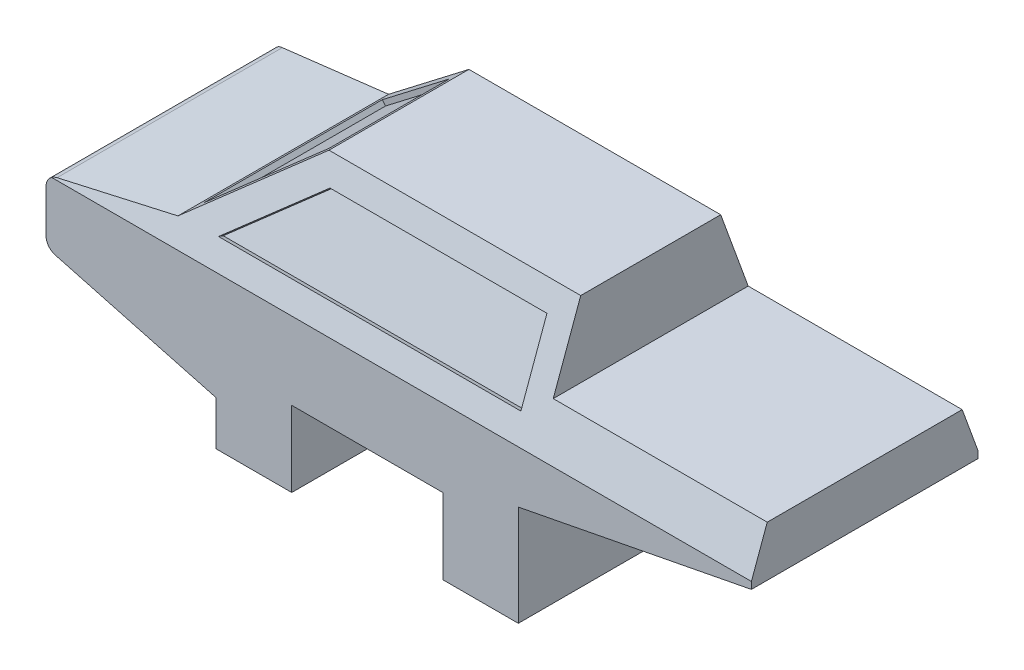
ISO-10303-21;
HEADER;
FILE_DESCRIPTION(('STEP AP214'),'2;1');
FILE_NAME('part.step','',(''),(''),'','','');
FILE_SCHEMA(('AUTOMOTIVE_DESIGN { 1 0 10303 214 1 1 1 1 }'));
ENDSEC;
DATA;
#1=APPLICATION_CONTEXT('core data for automotive mechanical design processes');
#2=APPLICATION_PROTOCOL_DEFINITION('international standard','automotive_design',2000,#1);
#3=PRODUCT_CONTEXT('',#1,'mechanical');
#4=PRODUCT('Part','Part','',(#3));
#5=PRODUCT_RELATED_PRODUCT_CATEGORY('part','',(#4));
#6=PRODUCT_DEFINITION_FORMATION('','',#4);
#7=PRODUCT_DEFINITION_CONTEXT('part definition',#1,'design');
#8=PRODUCT_DEFINITION('design','',#6,#7);
#9=PRODUCT_DEFINITION_SHAPE('','',#8);
#10=(LENGTH_UNIT() NAMED_UNIT(*) SI_UNIT(.MILLI.,.METRE.));
#11=(NAMED_UNIT(*) PLANE_ANGLE_UNIT() SI_UNIT($,.RADIAN.));
#12=(NAMED_UNIT(*) SI_UNIT($,.STERADIAN.) SOLID_ANGLE_UNIT());
#13=UNCERTAINTY_MEASURE_WITH_UNIT(LENGTH_MEASURE(1.E-05),#10,'distance_accuracy_value','');
#14=(GEOMETRIC_REPRESENTATION_CONTEXT(3) GLOBAL_UNCERTAINTY_ASSIGNED_CONTEXT((#13)) GLOBAL_UNIT_ASSIGNED_CONTEXT((#10,
#11,#12)) REPRESENTATION_CONTEXT('',''));
#15=CARTESIAN_POINT('',(0.,0.,0.));
#16=DIRECTION('',(0.,0.,1.));
#17=DIRECTION('',(1.,0.,0.));
#18=AXIS2_PLACEMENT_3D('',#15,#16,#17);
#19=CARTESIAN_POINT('',(-125.894137158887,-3.70477981050452,-90.));
#20=DIRECTION('',(-0.173648177666928,0.984807753012208,0.));
#21=DIRECTION('',(-0.984807753012209,-0.173648177666928,0.));
#22=AXIS2_PLACEMENT_3D('',#19,#20,#21);
#23=PLANE('',#22);
#24=DIRECTION('',(0.982846674800219,0.173302386666874,0.0630769102740334));
#25=VECTOR('',#24,1.);
#26=CARTESIAN_POINT('',(-125.894137158887,-3.70477981050452,-90.));
#27=LINE('',#26,#25);
#28=CARTESIAN_POINT('',(-121.762378047222,-2.97623920132988,-89.7348329038063));
#29=VERTEX_POINT('',#28);
#30=CARTESIAN_POINT('',(-76.6537495082768,4.97762907284185,-86.8398616047335));
#31=VERTEX_POINT('',#30);
#32=EDGE_CURVE('E361',#29,#31,#27,.T.);
#33=ORIENTED_EDGE('',*,*,#32,.F.);
#34=DIRECTION('',(0.,0.,1.));
#35=VECTOR('',#34,1.);
#36=CARTESIAN_POINT('',(-121.762378047222,-2.97623920132988,-90.));
#37=LINE('',#36,#35);
#38=CARTESIAN_POINT('',(-121.762378047222,-2.97623920132988,-0.265167096193721));
#39=VERTEX_POINT('',#38);
#40=EDGE_CURVE('E493',#29,#39,#37,.T.);
#41=ORIENTED_EDGE('',*,*,#40,.T.);
#42=DIRECTION('',(0.982846674800219,0.173302386666874,-0.0630769102740334));
#43=VECTOR('',#42,1.);
#44=CARTESIAN_POINT('',(-120.314593322132,-2.72095569203891,-0.358082694874653));
#45=LINE('',#44,#43);
#46=CARTESIAN_POINT('',(-76.6537495082768,4.97762907284184,-3.1601383952665));
#47=VERTEX_POINT('',#46);
#48=EDGE_CURVE('E378',#39,#47,#45,.T.);
#49=ORIENTED_EDGE('',*,*,#48,.T.);
#50=DIRECTION('',(0.,0.,1.));
#51=VECTOR('',#50,1.);
#52=CARTESIAN_POINT('',(-76.6537495082768,4.97762907284184,-90.));
#53=LINE('',#52,#51);
#54=EDGE_CURVE('E445',#31,#47,#53,.T.);
#55=ORIENTED_EDGE('',*,*,#54,.F.);
#56=EDGE_LOOP('',(#33,#41,#49,#55));
#57=FACE_BOUND('',#56,.T.);
#58=ADVANCED_FACE('F37',(#57),#23,.T.);
#59=CARTESIAN_POINT('',(-76.6537495082768,4.97762907284184,-90.));
#60=DIRECTION('',(-0.642787609686538,0.766044443118979,0.));
#61=DIRECTION('',(-0.766044443118979,-0.642787609686538,0.));
#62=AXIS2_PLACEMENT_3D('',#59,#60,#61);
#63=PLANE('',#62);
#64=DIRECTION('',(-0.745902814675494,-0.6258867766883,-0.227804156735355));
#65=VECTOR('',#64,1.);
#66=CARTESIAN_POINT('',(-34.521305136733,40.3309476056015,-68.8372908774791));
#67=LINE('',#66,#65);
#68=CARTESIAN_POINT('',(-34.521305136733,40.3309476056015,-68.8372908774791));
#69=VERTEX_POINT('',#68);
#70=CARTESIAN_POINT('',(-72.8235272926819,8.19156712127452,-80.53506872153));
#71=VERTEX_POINT('',#70);
#72=EDGE_CURVE('E284',#69,#71,#67,.T.);
#73=ORIENTED_EDGE('',*,*,#72,.F.);
#74=DIRECTION('',(0.,0.,-1.));
#75=VECTOR('',#74,1.);
#76=CARTESIAN_POINT('',(-34.521305136733,40.3309476056015,-21.1627091225209));
#77=LINE('',#76,#75);
#78=CARTESIAN_POINT('',(-34.521305136733,40.3309476056015,-21.1627091225209));
#79=VERTEX_POINT('',#78);
#80=EDGE_CURVE('E292',#79,#69,#77,.T.);
#81=ORIENTED_EDGE('',*,*,#80,.F.);
#82=DIRECTION('',(0.745902814675494,0.6258867766883,-0.227804156735355));
#83=VECTOR('',#82,1.);
#84=CARTESIAN_POINT('',(-72.8235272926819,8.19156712127454,-9.46493127847));
#85=LINE('',#84,#83);
#86=CARTESIAN_POINT('',(-72.8235272926819,8.19156712127454,-9.46493127847));
#87=VERTEX_POINT('',#86);
#88=EDGE_CURVE('E306',#87,#79,#85,.T.);
#89=ORIENTED_EDGE('',*,*,#88,.F.);
#90=DIRECTION('',(0.,0.,1.));
#91=VECTOR('',#90,1.);
#92=CARTESIAN_POINT('',(-72.8235272926819,8.19156712127454,-80.53506872153));
#93=LINE('',#92,#91);
#94=EDGE_CURVE('E303',#71,#87,#93,.T.);
#95=ORIENTED_EDGE('',*,*,#94,.F.);
#96=EDGE_LOOP('',(#73,#81,#89,#95));
#97=FACE_BOUND('',#96,.T.);
#98=DIRECTION('',(0.745902814675494,0.6258867766883,0.227804156735355));
#99=VECTOR('',#98,1.);
#100=CARTESIAN_POINT('',(-77.1907194713511,4.5270577748729,-87.0038561456089));
#101=LINE('',#100,#99);
#102=CARTESIAN_POINT('',(-30.6910829211381,43.5448856540341,-72.8025281918725));
#103=VERTEX_POINT('',#102);
#104=EDGE_CURVE('E359',#31,#103,#101,.T.);
#105=ORIENTED_EDGE('',*,*,#104,.F.);
#106=ORIENTED_EDGE('',*,*,#54,.T.);
#107=DIRECTION('',(0.745902814675494,0.6258867766883,-0.227804156735355));
#108=VECTOR('',#107,1.);
#109=CARTESIAN_POINT('',(-61.8979409180201,17.3592226186488,-7.66666989872267));
#110=LINE('',#109,#108);
#111=CARTESIAN_POINT('',(-30.6910829211381,43.5448856540341,-17.1974718081275));
#112=VERTEX_POINT('',#111);
#113=EDGE_CURVE('E375',#47,#112,#110,.T.);
#114=ORIENTED_EDGE('',*,*,#113,.T.);
#115=DIRECTION('',(0.,0.,1.));
#116=VECTOR('',#115,1.);
#117=CARTESIAN_POINT('',(-30.6910829211381,43.5448856540341,-90.));
#118=LINE('',#117,#116);
#119=EDGE_CURVE('E449',#103,#112,#118,.T.);
#120=ORIENTED_EDGE('',*,*,#119,.F.);
#121=EDGE_LOOP('',(#105,#106,#114,#120));
#122=FACE_BOUND('',#121,.T.);
#123=ADVANCED_FACE('F576',(#97,#122),#63,.T.);
#124=CARTESIAN_POINT('',(-30.6910829211381,43.5448856540341,-90.));
#125=DIRECTION('',(0.,1.,0.));
#126=DIRECTION('',(0.,0.,1.));
#127=AXIS2_PLACEMENT_3D('',#124,#125,#126);
#128=PLANE('',#127);
#129=DIRECTION('',(1.,0.,0.));
#130=VECTOR('',#129,1.);
#131=CARTESIAN_POINT('',(-30.6910829211381,43.5448856540341,-72.8025281918725));
#132=LINE('',#131,#130);
#133=CARTESIAN_POINT('',(69.3089170788619,43.5448856540341,-72.8025281918724));
#134=VERTEX_POINT('',#133);
#135=EDGE_CURVE('E357',#103,#134,#132,.T.);
#136=ORIENTED_EDGE('',*,*,#135,.F.);
#137=ORIENTED_EDGE('',*,*,#119,.T.);
#138=DIRECTION('',(1.,0.,0.));
#139=VECTOR('',#138,1.);
#140=CARTESIAN_POINT('',(-30.691082921138,43.5448856540341,-17.1974718081275));
#141=LINE('',#140,#139);
#142=CARTESIAN_POINT('',(69.3089170788619,43.5448856540341,-17.1974718081276));
#143=VERTEX_POINT('',#142);
#144=EDGE_CURVE('E372',#112,#143,#141,.T.);
#145=ORIENTED_EDGE('',*,*,#144,.T.);
#146=DIRECTION('',(0.,0.,1.));
#147=VECTOR('',#146,1.);
#148=CARTESIAN_POINT('',(69.3089170788619,43.5448856540341,-90.));
#149=LINE('',#148,#147);
#150=EDGE_CURVE('E451',#134,#143,#149,.T.);
#151=ORIENTED_EDGE('',*,*,#150,.F.);
#152=EDGE_LOOP('',(#136,#137,#145,#151));
#153=FACE_BOUND('',#152,.T.);
#154=ADVANCED_FACE('F572',(#153),#128,.T.);
#155=CARTESIAN_POINT('',(69.3089170788619,43.5448856540341,-90.));
#156=DIRECTION('',(1.,0.,0.));
#157=DIRECTION('',(0.,0.,-1.));
#158=AXIS2_PLACEMENT_3D('',#155,#156,#157);
#159=PLANE('',#158);
#160=DIRECTION('',(0.,-0.939692620785911,-0.342020143325663));
#161=VECTOR('',#160,1.);
#162=CARTESIAN_POINT('',(69.3089170788619,38.0177247559352,-74.8142502387804));
#163=LINE('',#162,#161);
#164=CARTESIAN_POINT('',(69.3089170788619,13.5448856540341,-83.7216352198583));
#165=VERTEX_POINT('',#164);
#166=EDGE_CURVE('E355',#134,#165,#163,.T.);
#167=ORIENTED_EDGE('',*,*,#166,.F.);
#168=ORIENTED_EDGE('',*,*,#150,.T.);
#169=DIRECTION('',(0.,-0.939692620785911,0.342020143325663));
#170=VECTOR('',#169,1.);
#171=CARTESIAN_POINT('',(69.3089170788619,66.9431671918291,-25.7137498208652));
#172=LINE('',#171,#170);
#173=CARTESIAN_POINT('',(69.3089170788619,13.5448856540341,-6.27836478014172));
#174=VERTEX_POINT('',#173);
#175=EDGE_CURVE('E369',#143,#174,#172,.T.);
#176=ORIENTED_EDGE('',*,*,#175,.T.);
#177=DIRECTION('',(0.,0.,1.));
#178=VECTOR('',#177,1.);
#179=CARTESIAN_POINT('',(69.3089170788619,13.5448856540341,-90.));
#180=LINE('',#179,#178);
#181=EDGE_CURVE('E453',#165,#174,#180,.T.);
#182=ORIENTED_EDGE('',*,*,#181,.F.);
#183=EDGE_LOOP('',(#167,#168,#176,#182));
#184=FACE_BOUND('',#183,.T.);
#185=ADVANCED_FACE('F567',(#184),#159,.T.);
#186=CARTESIAN_POINT('',(69.3089170788619,13.5448856540341,-90.));
#187=DIRECTION('',(0.,1.,0.));
#188=DIRECTION('',(-1.,0.,0.));
#189=AXIS2_PLACEMENT_3D('',#186,#187,#188);
#190=PLANE('',#189);
#191=DIRECTION('',(1.,0.,0.));
#192=VECTOR('',#191,1.);
#193=CARTESIAN_POINT('',(69.3089170788619,13.5448856540341,-83.7216352198583));
#194=LINE('',#193,#192);
#195=CARTESIAN_POINT('',(154.308917078862,13.5448856540341,-83.7216352198583));
#196=VERTEX_POINT('',#195);
#197=EDGE_CURVE('E353',#165,#196,#194,.T.);
#198=ORIENTED_EDGE('',*,*,#197,.F.);
#199=ORIENTED_EDGE('',*,*,#181,.T.);
#200=DIRECTION('',(1.,0.,0.));
#201=VECTOR('',#200,1.);
#202=CARTESIAN_POINT('',(69.308917078862,13.5448856540341,-6.27836478014172));
#203=LINE('',#202,#201);
#204=CARTESIAN_POINT('',(154.308917078862,13.5448856540341,-6.27836478014174));
#205=VERTEX_POINT('',#204);
#206=EDGE_CURVE('E366',#174,#205,#203,.T.);
#207=ORIENTED_EDGE('',*,*,#206,.T.);
#208=DIRECTION('',(0.,0.,1.));
#209=VECTOR('',#208,1.);
#210=CARTESIAN_POINT('',(154.308917078862,13.5448856540341,-90.));
#211=LINE('',#210,#209);
#212=EDGE_CURVE('E455',#196,#205,#211,.T.);
#213=ORIENTED_EDGE('',*,*,#212,.F.);
#214=EDGE_LOOP('',(#198,#199,#207,#213));
#215=FACE_BOUND('',#214,.T.);
#216=ADVANCED_FACE('F563',(#215),#190,.T.);
#217=CARTESIAN_POINT('',(154.308917078862,13.5448856540341,-90.));
#218=DIRECTION('',(1.,0.,0.));
#219=DIRECTION('',(0.,0.,-1.));
#220=AXIS2_PLACEMENT_3D('',#217,#218,#219);
#221=PLANE('',#220);
#222=DIRECTION('',(0.,-0.939692620785911,-0.342020143325663));
#223=VECTOR('',#222,1.);
#224=CARTESIAN_POINT('',(154.308917078862,11.5270581091504,-84.4560643840784));
#225=LINE('',#224,#223);
#226=CARTESIAN_POINT('',(154.308917078862,-3.70477981050462,-90.));
#227=VERTEX_POINT('',#226);
#228=EDGE_CURVE('E345',#196,#227,#225,.T.);
#229=ORIENTED_EDGE('',*,*,#228,.F.);
#230=ORIENTED_EDGE('',*,*,#212,.T.);
#231=DIRECTION('',(0.,-0.939692620785911,0.342020143325663));
#232=VECTOR('',#231,1.);
#233=CARTESIAN_POINT('',(154.308917078862,40.4525005450443,-16.0719356755673));
#234=LINE('',#233,#232);
#235=CARTESIAN_POINT('',(154.308917078862,-3.70477981050483,0.));
#236=VERTEX_POINT('',#235);
#237=EDGE_CURVE('E363',#205,#236,#234,.T.);
#238=ORIENTED_EDGE('',*,*,#237,.T.);
#239=DIRECTION('',(0.,1.,0.));
#240=VECTOR('',#239,1.);
#241=CARTESIAN_POINT('',(154.308917078862,13.5448856540341,0.));
#242=LINE('',#241,#240);
#243=CARTESIAN_POINT('',(154.308917078862,-6.45511434596587,0.));
#244=VERTEX_POINT('',#243);
#245=EDGE_CURVE('E440',#244,#236,#242,.T.);
#246=ORIENTED_EDGE('',*,*,#245,.F.);
#247=DIRECTION('',(0.,0.,1.));
#248=VECTOR('',#247,1.);
#249=CARTESIAN_POINT('',(154.308917078862,-6.45511434596587,-90.));
#250=LINE('',#249,#248);
#251=CARTESIAN_POINT('',(154.308917078862,-6.45511434596587,-90.));
#252=VERTEX_POINT('',#251);
#253=EDGE_CURVE('E457',#252,#244,#250,.T.);
#254=ORIENTED_EDGE('',*,*,#253,.F.);
#255=DIRECTION('',(0.,1.,0.));
#256=VECTOR('',#255,1.);
#257=CARTESIAN_POINT('',(154.308917078862,13.5448856540341,-90.));
#258=LINE('',#257,#256);
#259=EDGE_CURVE('E408',#252,#227,#258,.T.);
#260=ORIENTED_EDGE('',*,*,#259,.T.);
#261=EDGE_LOOP('',(#229,#230,#238,#246,#254,#260));
#262=FACE_BOUND('',#261,.T.);
#263=ADVANCED_FACE('F557',(#262),#221,.T.);
#264=CARTESIAN_POINT('',(0.,0.,0.));
#265=DIRECTION('',(0.,0.,-1.));
#266=DIRECTION('',(-1.,0.,0.));
#267=AXIS2_PLACEMENT_3D('',#264,#265,#266);
#268=PLANE('',#267);
#269=DIRECTION('',(0.,-1.,0.));
#270=VECTOR('',#269,1.);
#271=CARTESIAN_POINT('',(-125.894137158887,-28.7047798105045,0.));
#272=LINE('',#271,#270);
#273=CARTESIAN_POINT('',(-125.894137158887,-7.90027796639092,0.));
#274=VERTEX_POINT('',#273);
#275=CARTESIAN_POINT('',(-125.894137158887,-24.8681448706097,0.));
#276=VERTEX_POINT('',#275);
#277=EDGE_CURVE('E384',#274,#276,#272,.T.);
#278=ORIENTED_EDGE('',*,*,#277,.T.);
#279=CARTESIAN_POINT('',(-120.894137158887,-24.8681448706097,0.));
#280=DIRECTION('',(0.,0.,-1.));
#281=DIRECTION('',(-1.,0.,0.));
#282=AXIS2_PLACEMENT_3D('',#279,#280,#281);
#283=CIRCLE('',#282,5.);
#284=CARTESIAN_POINT('',(-122.1882323844,-29.697774002055,0.));
#285=VERTEX_POINT('',#284);
#286=EDGE_CURVE('E485',#276,#285,#283,.F.);
#287=ORIENTED_EDGE('',*,*,#286,.T.);
#288=DIRECTION('',(0.965925826289069,-0.258819045102518,0.));
#289=VECTOR('',#288,1.);
#290=CARTESIAN_POINT('',(-58.2793293186523,-46.8221129676808,0.));
#291=LINE('',#290,#289);
#292=CARTESIAN_POINT('',(-58.2793293186523,-46.8221129676808,0.));
#293=VERTEX_POINT('',#292);
#294=EDGE_CURVE('E380',#285,#293,#291,.T.);
#295=ORIENTED_EDGE('',*,*,#294,.T.);
#296=DIRECTION('',(0.,-1.,0.));
#297=VECTOR('',#296,1.);
#298=CARTESIAN_POINT('',(-58.2793293186523,-64.4110457740048,0.));
#299=LINE('',#298,#297);
#300=CARTESIAN_POINT('',(-58.2793293186523,-64.4110457740048,0.));
#301=VERTEX_POINT('',#300);
#302=EDGE_CURVE('E416',#293,#301,#299,.T.);
#303=ORIENTED_EDGE('',*,*,#302,.T.);
#304=DIRECTION('',(1.,0.,0.));
#305=VECTOR('',#304,1.);
#306=CARTESIAN_POINT('',(-28.2793293186523,-64.4110457740048,0.));
#307=LINE('',#306,#305);
#308=CARTESIAN_POINT('',(-28.2793293186523,-64.4110457740048,0.));
#309=VERTEX_POINT('',#308);
#310=EDGE_CURVE('E419',#301,#309,#307,.T.);
#311=ORIENTED_EDGE('',*,*,#310,.T.);
#312=DIRECTION('',(0.,1.,0.));
#313=VECTOR('',#312,1.);
#314=CARTESIAN_POINT('',(-28.2793293186523,-34.4110457740048,0.));
#315=LINE('',#314,#313);
#316=CARTESIAN_POINT('',(-28.2793293186523,-34.4110457740048,0.));
#317=VERTEX_POINT('',#316);
#318=EDGE_CURVE('E422',#309,#317,#315,.T.);
#319=ORIENTED_EDGE('',*,*,#318,.T.);
#320=DIRECTION('',(1.,0.,0.));
#321=VECTOR('',#320,1.);
#322=CARTESIAN_POINT('',(31.7206706813477,-34.4110457740048,0.));
#323=LINE('',#322,#321);
#324=CARTESIAN_POINT('',(31.7206706813477,-34.4110457740048,0.));
#325=VERTEX_POINT('',#324);
#326=EDGE_CURVE('E425',#317,#325,#323,.T.);
#327=ORIENTED_EDGE('',*,*,#326,.T.);
#328=DIRECTION('',(0.,-1.,0.));
#329=VECTOR('',#328,1.);
#330=CARTESIAN_POINT('',(31.7206706813477,-64.4110457740048,0.));
#331=LINE('',#330,#329);
#332=CARTESIAN_POINT('',(31.7206706813477,-64.4110457740048,0.));
#333=VERTEX_POINT('',#332);
#334=EDGE_CURVE('E428',#325,#333,#331,.T.);
#335=ORIENTED_EDGE('',*,*,#334,.T.);
#336=DIRECTION('',(1.,0.,0.));
#337=VECTOR('',#336,1.);
#338=CARTESIAN_POINT('',(61.7206706813477,-64.4110457740048,0.));
#339=LINE('',#338,#337);
#340=CARTESIAN_POINT('',(61.7206706813477,-64.4110457740048,0.));
#341=VERTEX_POINT('',#340);
#342=EDGE_CURVE('E431',#333,#341,#339,.T.);
#343=ORIENTED_EDGE('',*,*,#342,.T.);
#344=DIRECTION('',(0.,1.,0.));
#345=VECTOR('',#344,1.);
#346=CARTESIAN_POINT('',(61.7206706813477,-24.4110457740048,0.));
#347=LINE('',#346,#345);
#348=CARTESIAN_POINT('',(61.7206706813477,-24.4110457740048,0.));
#349=VERTEX_POINT('',#348);
#350=EDGE_CURVE('E434',#341,#349,#347,.T.);
#351=ORIENTED_EDGE('',*,*,#350,.T.);
#352=DIRECTION('',(0.981709312483879,0.190385991560383,0.));
#353=VECTOR('',#352,1.);
#354=CARTESIAN_POINT('',(154.308917078862,-6.45511434596587,0.));
#355=LINE('',#354,#353);
#356=EDGE_CURVE('E437',#349,#244,#355,.T.);
#357=ORIENTED_EDGE('',*,*,#356,.T.);
#358=ORIENTED_EDGE('',*,*,#245,.T.);
#359=DIRECTION('',(1.,0.,0.));
#360=VECTOR('',#359,1.);
#361=CARTESIAN_POINT('',(0.,-3.70477981050466,0.));
#362=LINE('',#361,#360);
#363=CARTESIAN_POINT('',(-123.614025984548,-3.70477981050452,0.));
#364=VERTEX_POINT('',#363);
#365=EDGE_CURVE('E448',#364,#236,#362,.T.);
#366=ORIENTED_EDGE('',*,*,#365,.F.);
#367=CARTESIAN_POINT('',(-120.894137158887,-7.90027796639093,0.));
#368=DIRECTION('',(0.,0.,-1.));
#369=DIRECTION('',(-1.,0.,0.));
#370=AXIS2_PLACEMENT_3D('',#367,#368,#369);
#371=CIRCLE('',#370,5.);
#372=EDGE_CURVE('E483',#364,#274,#371,.F.);
#373=ORIENTED_EDGE('',*,*,#372,.T.);
#374=EDGE_LOOP('',(#278,#287,#295,#303,#311,#319,#327,#335,#343,#351,#357,#358,#366,#373));
#375=FACE_BOUND('',#374,.T.);
#376=ADVANCED_FACE('F501',(#375),#268,.F.);
#377=CARTESIAN_POINT('',(-58.2793293186523,-46.8221129676808,-90.));
#378=DIRECTION('',(-0.258819045102518,-0.965925826289069,0.));
#379=DIRECTION('',(0.965925826289069,-0.258819045102518,0.));
#380=AXIS2_PLACEMENT_3D('',#377,#378,#379);
#381=PLANE('',#380);
#382=ORIENTED_EDGE('',*,*,#294,.F.);
#383=DIRECTION('',(0.,0.,1.));
#384=VECTOR('',#383,1.);
#385=CARTESIAN_POINT('',(-122.1882323844,-29.697774002055,-90.));
#386=LINE('',#385,#384);
#387=CARTESIAN_POINT('',(-122.1882323844,-29.697774002055,-90.));
#388=VERTEX_POINT('',#387);
#389=EDGE_CURVE('E487',#285,#388,#386,.F.);
#390=ORIENTED_EDGE('',*,*,#389,.T.);
#391=DIRECTION('',(0.965925826289069,-0.258819045102518,0.));
#392=VECTOR('',#391,1.);
#393=CARTESIAN_POINT('',(-58.2793293186523,-46.8221129676808,-90.));
#394=LINE('',#393,#392);
#395=CARTESIAN_POINT('',(-58.2793293186523,-46.8221129676808,-90.));
#396=VERTEX_POINT('',#395);
#397=EDGE_CURVE('E381',#388,#396,#394,.T.);
#398=ORIENTED_EDGE('',*,*,#397,.T.);
#399=DIRECTION('',(0.,0.,1.));
#400=VECTOR('',#399,1.);
#401=CARTESIAN_POINT('',(-58.2793293186523,-46.8221129676808,-90.));
#402=LINE('',#401,#400);
#403=EDGE_CURVE('E414',#396,#293,#402,.T.);
#404=ORIENTED_EDGE('',*,*,#403,.T.);
#405=EDGE_LOOP('',(#382,#390,#398,#404));
#406=FACE_BOUND('',#405,.T.);
#407=ADVANCED_FACE('F521',(#406),#381,.T.);
#408=CARTESIAN_POINT('',(-125.894137158887,-28.7047798105045,-90.));
#409=DIRECTION('',(-1.,0.,0.));
#410=DIRECTION('',(0.,-1.,0.));
#411=AXIS2_PLACEMENT_3D('',#408,#409,#410);
#412=PLANE('',#411);
#413=DIRECTION('',(0.,-1.,0.));
#414=VECTOR('',#413,1.);
#415=CARTESIAN_POINT('',(-125.894137158887,-28.7047798105045,-90.));
#416=LINE('',#415,#414);
#417=CARTESIAN_POINT('',(-125.894137158887,-7.90027796639092,-90.));
#418=VERTEX_POINT('',#417);
#419=CARTESIAN_POINT('',(-125.894137158887,-24.8681448706097,-90.));
#420=VERTEX_POINT('',#419);
#421=EDGE_CURVE('E411',#418,#420,#416,.T.);
#422=ORIENTED_EDGE('',*,*,#421,.T.);
#423=DIRECTION('',(0.,0.,1.));
#424=VECTOR('',#423,1.);
#425=CARTESIAN_POINT('',(-125.894137158887,-24.8681448706097,-90.));
#426=LINE('',#425,#424);
#427=EDGE_CURVE('E480',#420,#276,#426,.T.);
#428=ORIENTED_EDGE('',*,*,#427,.T.);
#429=ORIENTED_EDGE('',*,*,#277,.F.);
#430=DIRECTION('',(0.,0.,1.));
#431=VECTOR('',#430,1.);
#432=CARTESIAN_POINT('',(-125.894137158887,-7.90027796639092,-90.));
#433=LINE('',#432,#431);
#434=EDGE_CURVE('E478',#274,#418,#433,.F.);
#435=ORIENTED_EDGE('',*,*,#434,.T.);
#436=EDGE_LOOP('',(#422,#428,#429,#435));
#437=FACE_BOUND('',#436,.T.);
#438=ADVANCED_FACE('F508',(#437),#412,.T.);
#439=CARTESIAN_POINT('',(154.308917078862,-6.45511434596587,-90.));
#440=DIRECTION('',(0.190385991560383,-0.981709312483879,0.));
#441=DIRECTION('',(0.981709312483879,0.190385991560383,0.));
#442=AXIS2_PLACEMENT_3D('',#439,#440,#441);
#443=PLANE('',#442);
#444=ORIENTED_EDGE('',*,*,#356,.F.);
#445=DIRECTION('',(0.,0.,1.));
#446=VECTOR('',#445,1.);
#447=CARTESIAN_POINT('',(61.7206706813477,-24.4110457740048,-90.));
#448=LINE('',#447,#446);
#449=CARTESIAN_POINT('',(61.7206706813477,-24.4110457740048,-90.));
#450=VERTEX_POINT('',#449);
#451=EDGE_CURVE('E459',#450,#349,#448,.T.);
#452=ORIENTED_EDGE('',*,*,#451,.F.);
#453=DIRECTION('',(0.981709312483879,0.190385991560383,0.));
#454=VECTOR('',#453,1.);
#455=CARTESIAN_POINT('',(154.308917078862,-6.45511434596587,-90.));
#456=LINE('',#455,#454);
#457=EDGE_CURVE('E405',#450,#252,#456,.T.);
#458=ORIENTED_EDGE('',*,*,#457,.T.);
#459=ORIENTED_EDGE('',*,*,#253,.T.);
#460=EDGE_LOOP('',(#444,#452,#458,#459));
#461=FACE_BOUND('',#460,.T.);
#462=ADVANCED_FACE('F552',(#461),#443,.T.);
#463=CARTESIAN_POINT('',(61.7206706813477,-24.4110457740048,-90.));
#464=DIRECTION('',(1.,0.,0.));
#465=DIRECTION('',(0.,0.,-1.));
#466=AXIS2_PLACEMENT_3D('',#463,#464,#465);
#467=PLANE('',#466);
#468=ORIENTED_EDGE('',*,*,#350,.F.);
#469=DIRECTION('',(0.,0.,1.));
#470=VECTOR('',#469,1.);
#471=CARTESIAN_POINT('',(61.7206706813477,-64.4110457740048,-90.));
#472=LINE('',#471,#470);
#473=CARTESIAN_POINT('',(61.7206706813477,-64.4110457740048,-90.));
#474=VERTEX_POINT('',#473);
#475=EDGE_CURVE('E461',#474,#341,#472,.T.);
#476=ORIENTED_EDGE('',*,*,#475,.F.);
#477=DIRECTION('',(0.,1.,0.));
#478=VECTOR('',#477,1.);
#479=CARTESIAN_POINT('',(61.7206706813477,-24.4110457740048,-90.));
#480=LINE('',#479,#478);
#481=EDGE_CURVE('E402',#474,#450,#480,.T.);
#482=ORIENTED_EDGE('',*,*,#481,.T.);
#483=ORIENTED_EDGE('',*,*,#451,.T.);
#484=EDGE_LOOP('',(#468,#476,#482,#483));
#485=FACE_BOUND('',#484,.T.);
#486=ADVANCED_FACE('F549',(#485),#467,.T.);
#487=CARTESIAN_POINT('',(61.7206706813477,-64.4110457740048,-90.));
#488=DIRECTION('',(0.,-1.,0.));
#489=DIRECTION('',(0.,0.,-1.));
#490=AXIS2_PLACEMENT_3D('',#487,#488,#489);
#491=PLANE('',#490);
#492=ORIENTED_EDGE('',*,*,#342,.F.);
#493=DIRECTION('',(0.,0.,1.));
#494=VECTOR('',#493,1.);
#495=CARTESIAN_POINT('',(31.7206706813477,-64.4110457740048,-90.));
#496=LINE('',#495,#494);
#497=CARTESIAN_POINT('',(31.7206706813477,-64.4110457740048,-90.));
#498=VERTEX_POINT('',#497);
#499=EDGE_CURVE('E463',#498,#333,#496,.T.);
#500=ORIENTED_EDGE('',*,*,#499,.F.);
#501=DIRECTION('',(1.,0.,0.));
#502=VECTOR('',#501,1.);
#503=CARTESIAN_POINT('',(61.7206706813477,-64.4110457740048,-90.));
#504=LINE('',#503,#502);
#505=EDGE_CURVE('E399',#498,#474,#504,.T.);
#506=ORIENTED_EDGE('',*,*,#505,.T.);
#507=ORIENTED_EDGE('',*,*,#475,.T.);
#508=EDGE_LOOP('',(#492,#500,#506,#507));
#509=FACE_BOUND('',#508,.T.);
#510=ADVANCED_FACE('F545',(#509),#491,.T.);
#511=CARTESIAN_POINT('',(31.7206706813477,-64.4110457740048,-90.));
#512=DIRECTION('',(-1.,0.,0.));
#513=DIRECTION('',(0.,-1.,0.));
#514=AXIS2_PLACEMENT_3D('',#511,#512,#513);
#515=PLANE('',#514);
#516=ORIENTED_EDGE('',*,*,#334,.F.);
#517=DIRECTION('',(0.,0.,1.));
#518=VECTOR('',#517,1.);
#519=CARTESIAN_POINT('',(31.7206706813477,-34.4110457740048,-90.));
#520=LINE('',#519,#518);
#521=CARTESIAN_POINT('',(31.7206706813477,-34.4110457740048,-90.));
#522=VERTEX_POINT('',#521);
#523=EDGE_CURVE('E465',#522,#325,#520,.T.);
#524=ORIENTED_EDGE('',*,*,#523,.F.);
#525=DIRECTION('',(0.,-1.,0.));
#526=VECTOR('',#525,1.);
#527=CARTESIAN_POINT('',(31.7206706813477,-64.4110457740048,-90.));
#528=LINE('',#527,#526);
#529=EDGE_CURVE('E396',#522,#498,#528,.T.);
#530=ORIENTED_EDGE('',*,*,#529,.T.);
#531=ORIENTED_EDGE('',*,*,#499,.T.);
#532=EDGE_LOOP('',(#516,#524,#530,#531));
#533=FACE_BOUND('',#532,.T.);
#534=ADVANCED_FACE('F541',(#533),#515,.T.);
#535=CARTESIAN_POINT('',(31.7206706813477,-34.4110457740048,-90.));
#536=DIRECTION('',(0.,-1.,0.));
#537=DIRECTION('',(1.,0.,0.));
#538=AXIS2_PLACEMENT_3D('',#535,#536,#537);
#539=PLANE('',#538);
#540=ORIENTED_EDGE('',*,*,#326,.F.);
#541=DIRECTION('',(0.,0.,1.));
#542=VECTOR('',#541,1.);
#543=CARTESIAN_POINT('',(-28.2793293186523,-34.4110457740048,-90.));
#544=LINE('',#543,#542);
#545=CARTESIAN_POINT('',(-28.2793293186523,-34.4110457740048,-90.));
#546=VERTEX_POINT('',#545);
#547=EDGE_CURVE('E467',#546,#317,#544,.T.);
#548=ORIENTED_EDGE('',*,*,#547,.F.);
#549=DIRECTION('',(1.,0.,0.));
#550=VECTOR('',#549,1.);
#551=CARTESIAN_POINT('',(31.7206706813477,-34.4110457740048,-90.));
#552=LINE('',#551,#550);
#553=EDGE_CURVE('E393',#546,#522,#552,.T.);
#554=ORIENTED_EDGE('',*,*,#553,.T.);
#555=ORIENTED_EDGE('',*,*,#523,.T.);
#556=EDGE_LOOP('',(#540,#548,#554,#555));
#557=FACE_BOUND('',#556,.T.);
#558=ADVANCED_FACE('F537',(#557),#539,.T.);
#559=CARTESIAN_POINT('',(-28.2793293186523,-34.4110457740048,-90.));
#560=DIRECTION('',(1.,0.,0.));
#561=DIRECTION('',(0.,1.,0.));
#562=AXIS2_PLACEMENT_3D('',#559,#560,#561);
#563=PLANE('',#562);
#564=ORIENTED_EDGE('',*,*,#318,.F.);
#565=DIRECTION('',(0.,0.,1.));
#566=VECTOR('',#565,1.);
#567=CARTESIAN_POINT('',(-28.2793293186523,-64.4110457740048,-90.));
#568=LINE('',#567,#566);
#569=CARTESIAN_POINT('',(-28.2793293186523,-64.4110457740048,-90.));
#570=VERTEX_POINT('',#569);
#571=EDGE_CURVE('E469',#570,#309,#568,.T.);
#572=ORIENTED_EDGE('',*,*,#571,.F.);
#573=DIRECTION('',(0.,1.,0.));
#574=VECTOR('',#573,1.);
#575=CARTESIAN_POINT('',(-28.2793293186523,-34.4110457740048,-90.));
#576=LINE('',#575,#574);
#577=EDGE_CURVE('E390',#570,#546,#576,.T.);
#578=ORIENTED_EDGE('',*,*,#577,.T.);
#579=ORIENTED_EDGE('',*,*,#547,.T.);
#580=EDGE_LOOP('',(#564,#572,#578,#579));
#581=FACE_BOUND('',#580,.T.);
#582=ADVANCED_FACE('F533',(#581),#563,.T.);
#583=CARTESIAN_POINT('',(-28.2793293186523,-64.4110457740048,-90.));
#584=DIRECTION('',(0.,-1.,0.));
#585=DIRECTION('',(0.,0.,-1.));
#586=AXIS2_PLACEMENT_3D('',#583,#584,#585);
#587=PLANE('',#586);
#588=ORIENTED_EDGE('',*,*,#310,.F.);
#589=DIRECTION('',(0.,0.,1.));
#590=VECTOR('',#589,1.);
#591=CARTESIAN_POINT('',(-58.2793293186523,-64.4110457740048,-90.));
#592=LINE('',#591,#590);
#593=CARTESIAN_POINT('',(-58.2793293186523,-64.4110457740048,-90.));
#594=VERTEX_POINT('',#593);
#595=EDGE_CURVE('E471',#594,#301,#592,.T.);
#596=ORIENTED_EDGE('',*,*,#595,.F.);
#597=DIRECTION('',(1.,0.,0.));
#598=VECTOR('',#597,1.);
#599=CARTESIAN_POINT('',(-28.2793293186523,-64.4110457740048,-90.));
#600=LINE('',#599,#598);
#601=EDGE_CURVE('E387',#594,#570,#600,.T.);
#602=ORIENTED_EDGE('',*,*,#601,.T.);
#603=ORIENTED_EDGE('',*,*,#571,.T.);
#604=EDGE_LOOP('',(#588,#596,#602,#603));
#605=FACE_BOUND('',#604,.T.);
#606=ADVANCED_FACE('F529',(#605),#587,.T.);
#607=CARTESIAN_POINT('',(-58.2793293186523,-64.4110457740048,-90.));
#608=DIRECTION('',(-1.,0.,0.));
#609=DIRECTION('',(0.,0.,1.));
#610=AXIS2_PLACEMENT_3D('',#607,#608,#609);
#611=PLANE('',#610);
#612=ORIENTED_EDGE('',*,*,#302,.F.);
#613=ORIENTED_EDGE('',*,*,#403,.F.);
#614=DIRECTION('',(0.,-1.,0.));
#615=VECTOR('',#614,1.);
#616=CARTESIAN_POINT('',(-58.2793293186523,-64.4110457740048,-90.));
#617=LINE('',#616,#615);
#618=EDGE_CURVE('E383',#396,#594,#617,.T.);
#619=ORIENTED_EDGE('',*,*,#618,.T.);
#620=ORIENTED_EDGE('',*,*,#595,.T.);
#621=EDGE_LOOP('',(#612,#613,#619,#620));
#622=FACE_BOUND('',#621,.T.);
#623=ADVANCED_FACE('F525',(#622),#611,.T.);
#624=CARTESIAN_POINT('',(0.,0.,-90.));
#625=DIRECTION('',(0.,0.,-1.));
#626=DIRECTION('',(-1.,0.,0.));
#627=AXIS2_PLACEMENT_3D('',#624,#625,#626);
#628=PLANE('',#627);
#629=ORIENTED_EDGE('',*,*,#397,.F.);
#630=CARTESIAN_POINT('',(-120.894137158887,-24.8681448706097,-90.));
#631=DIRECTION('',(0.,0.,-1.));
#632=DIRECTION('',(-1.,0.,0.));
#633=AXIS2_PLACEMENT_3D('',#630,#631,#632);
#634=CIRCLE('',#633,5.);
#635=EDGE_CURVE('E491',#388,#420,#634,.T.);
#636=ORIENTED_EDGE('',*,*,#635,.T.);
#637=ORIENTED_EDGE('',*,*,#421,.F.);
#638=CARTESIAN_POINT('',(-120.894137158887,-7.90027796639093,-90.));
#639=DIRECTION('',(0.,0.,-1.));
#640=DIRECTION('',(-1.,0.,0.));
#641=AXIS2_PLACEMENT_3D('',#638,#639,#640);
#642=CIRCLE('',#641,5.);
#643=CARTESIAN_POINT('',(-123.614025984548,-3.70477981050447,-90.));
#644=VERTEX_POINT('',#643);
#645=EDGE_CURVE('E489',#418,#644,#642,.T.);
#646=ORIENTED_EDGE('',*,*,#645,.T.);
#647=DIRECTION('',(-1.,0.,0.));
#648=VECTOR('',#647,1.);
#649=CARTESIAN_POINT('',(0.,-3.70477981050461,-90.));
#650=LINE('',#649,#648);
#651=EDGE_CURVE('E476',#227,#644,#650,.T.);
#652=ORIENTED_EDGE('',*,*,#651,.F.);
#653=ORIENTED_EDGE('',*,*,#259,.F.);
#654=ORIENTED_EDGE('',*,*,#457,.F.);
#655=ORIENTED_EDGE('',*,*,#481,.F.);
#656=ORIENTED_EDGE('',*,*,#505,.F.);
#657=ORIENTED_EDGE('',*,*,#529,.F.);
#658=ORIENTED_EDGE('',*,*,#553,.F.);
#659=ORIENTED_EDGE('',*,*,#577,.F.);
#660=ORIENTED_EDGE('',*,*,#601,.F.);
#661=ORIENTED_EDGE('',*,*,#618,.F.);
#662=EDGE_LOOP('',(#629,#636,#637,#646,#652,#653,#654,#655,#656,#657,#658,#659,#660,#661));
#663=FACE_BOUND('',#662,.T.);
#664=ADVANCED_FACE('F512',(#663),#628,.T.);
#665=CARTESIAN_POINT('',(211.105862841113,-0.433376911844311,-1.1906932794046));
#666=DIRECTION('',(0.,0.342020143325663,0.939692620785911));
#667=DIRECTION('',(0.,-0.939692620785911,0.342020143325663));
#668=AXIS2_PLACEMENT_3D('',#665,#666,#667);
#669=PLANE('',#668);
#670=DIRECTION('',(-0.745902814675494,-0.6258867766883,0.227804156735355));
#671=VECTOR('',#670,1.);
#672=CARTESIAN_POINT('',(-26.8761237479261,34.147959446175,-13.7772703748709));
#673=LINE('',#672,#671);
#674=CARTESIAN_POINT('',(-26.8761237479261,34.147959446175,-13.7772703748709));
#675=VERTEX_POINT('',#674);
#676=CARTESIAN_POINT('',(-60.7884411790473,5.69214639735451,-3.42020143325663));
#677=VERTEX_POINT('',#676);
#678=EDGE_CURVE('E313',#675,#677,#673,.T.);
#679=ORIENTED_EDGE('',*,*,#678,.F.);
#680=DIRECTION('',(-1.,0.,0.));
#681=VECTOR('',#680,1.);
#682=CARTESIAN_POINT('',(59.3089170788619,34.147959446175,-13.7772703748709));
#683=LINE('',#682,#681);
#684=CARTESIAN_POINT('',(59.3089170788619,34.147959446175,-13.7772703748709));
#685=VERTEX_POINT('',#684);
#686=EDGE_CURVE('E324',#685,#675,#683,.T.);
#687=ORIENTED_EDGE('',*,*,#686,.F.);
#688=DIRECTION('',(0.,0.93969262078591,-0.342020143325663));
#689=VECTOR('',#688,1.);
#690=CARTESIAN_POINT('',(59.3089170788619,5.69214639735438,-3.42020143325663));
#691=LINE('',#690,#689);
#692=CARTESIAN_POINT('',(59.3089170788619,5.69214639735438,-3.42020143325663));
#693=VERTEX_POINT('',#692);
#694=EDGE_CURVE('E338',#693,#685,#691,.T.);
#695=ORIENTED_EDGE('',*,*,#694,.F.);
#696=DIRECTION('',(1.,0.,0.));
#697=VECTOR('',#696,1.);
#698=CARTESIAN_POINT('',(-60.7884411790473,5.69214639735452,-3.42020143325663));
#699=LINE('',#698,#697);
#700=EDGE_CURVE('E335',#677,#693,#699,.T.);
#701=ORIENTED_EDGE('',*,*,#700,.F.);
#702=EDGE_LOOP('',(#679,#687,#695,#701));
#703=FACE_BOUND('',#702,.T.);
#704=ORIENTED_EDGE('',*,*,#48,.F.);
#705=CARTESIAN_POINT('',(-120.894137158887,-7.90027796639093,1.52703644666137));
#706=DIRECTION('',(0.,0.342020143325663,0.939692620785911));
#707=DIRECTION('',(0.,-0.939692620785911,0.342020143325663));
#708=AXIS2_PLACEMENT_3D('',#705,#706,#707);
#709=ELLIPSE('',#708,5.32088886237955,5.);
#710=EDGE_CURVE('E45',#39,#364,#709,.T.);
#711=ORIENTED_EDGE('',*,*,#710,.T.);
#712=ORIENTED_EDGE('',*,*,#365,.T.);
#713=ORIENTED_EDGE('',*,*,#237,.F.);
#714=ORIENTED_EDGE('',*,*,#206,.F.);
#715=ORIENTED_EDGE('',*,*,#175,.F.);
#716=ORIENTED_EDGE('',*,*,#144,.F.);
#717=ORIENTED_EDGE('',*,*,#113,.F.);
#718=EDGE_LOOP('',(#704,#711,#712,#713,#714,#715,#716,#717));
#719=FACE_BOUND('',#718,.T.);
#720=ADVANCED_FACE('F497',(#703,#719),#669,.T.);
#721=CARTESIAN_POINT('',(211.105862841113,28.4920655240495,-78.2813066609498));
#722=DIRECTION('',(0.,-0.342020143325663,0.939692620785911));
#723=DIRECTION('',(0.,-0.939692620785911,-0.342020143325663));
#724=AXIS2_PLACEMENT_3D('',#721,#722,#723);
#725=PLANE('',#724);
#726=DIRECTION('',(0.745902814675494,0.6258867766883,0.227804156735355));
#727=VECTOR('',#726,1.);
#728=CARTESIAN_POINT('',(-60.7884411790472,5.69214639735457,-86.5797985667434));
#729=LINE('',#728,#727);
#730=CARTESIAN_POINT('',(-60.7884411790472,5.69214639735455,-86.5797985667434));
#731=VERTEX_POINT('',#730);
#732=CARTESIAN_POINT('',(-26.8761237479261,34.147959446175,-76.2227296251291));
#733=VERTEX_POINT('',#732);
#734=EDGE_CURVE('E278',#731,#733,#729,.T.);
#735=ORIENTED_EDGE('',*,*,#734,.F.);
#736=DIRECTION('',(-1.,0.,0.));
#737=VECTOR('',#736,1.);
#738=CARTESIAN_POINT('',(59.3089170788619,5.69214639735451,-86.5797985667434));
#739=LINE('',#738,#737);
#740=CARTESIAN_POINT('',(59.3089170788619,5.69214639735451,-86.5797985667434));
#741=VERTEX_POINT('',#740);
#742=EDGE_CURVE('E252',#741,#731,#739,.T.);
#743=ORIENTED_EDGE('',*,*,#742,.F.);
#744=DIRECTION('',(0.,-0.939692620785911,-0.342020143325663));
#745=VECTOR('',#744,1.);
#746=CARTESIAN_POINT('',(59.3089170788619,34.147959446175,-76.2227296251291));
#747=LINE('',#746,#745);
#748=CARTESIAN_POINT('',(59.3089170788619,34.147959446175,-76.2227296251291));
#749=VERTEX_POINT('',#748);
#750=EDGE_CURVE('E269',#749,#741,#747,.T.);
#751=ORIENTED_EDGE('',*,*,#750,.F.);
#752=DIRECTION('',(1.,0.,0.));
#753=VECTOR('',#752,1.);
#754=CARTESIAN_POINT('',(-26.8761237479261,34.147959446175,-76.2227296251291));
#755=LINE('',#754,#753);
#756=EDGE_CURVE('E272',#733,#749,#755,.T.);
#757=ORIENTED_EDGE('',*,*,#756,.F.);
#758=EDGE_LOOP('',(#735,#743,#751,#757));
#759=FACE_BOUND('',#758,.T.);
#760=ORIENTED_EDGE('',*,*,#651,.T.);
#761=CARTESIAN_POINT('',(-120.894137158887,-7.90027796639093,-91.5270364466614));
#762=DIRECTION('',(0.,-0.342020143325663,0.939692620785911));
#763=DIRECTION('',(0.,0.939692620785911,0.342020143325663));
#764=AXIS2_PLACEMENT_3D('',#761,#762,#763);
#765=ELLIPSE('',#764,5.32088886237955,5.);
#766=EDGE_CURVE('E11',#644,#29,#765,.F.);
#767=ORIENTED_EDGE('',*,*,#766,.T.);
#768=ORIENTED_EDGE('',*,*,#32,.T.);
#769=ORIENTED_EDGE('',*,*,#104,.T.);
#770=ORIENTED_EDGE('',*,*,#135,.T.);
#771=ORIENTED_EDGE('',*,*,#166,.T.);
#772=ORIENTED_EDGE('',*,*,#197,.T.);
#773=ORIENTED_EDGE('',*,*,#228,.T.);
#774=EDGE_LOOP('',(#760,#767,#768,#769,#770,#771,#772,#773));
#775=FACE_BOUND('',#774,.T.);
#776=ADVANCED_FACE('F579',(#759,#775),#725,.F.);
#777=CARTESIAN_POINT('',(-26.8761237479261,33.4639191595237,-15.6566556164427));
#778=DIRECTION('',(-0.666054795838282,0.700919370774002,-0.255113787582328));
#779=DIRECTION('',(-0.724905749583359,-0.688848063233823,0.));
#780=AXIS2_PLACEMENT_3D('',#777,#778,#779);
#781=PLANE('',#780);
#782=ORIENTED_EDGE('',*,*,#678,.T.);
#783=DIRECTION('',(0.,0.342020143325663,0.939692620785911));
#784=VECTOR('',#783,1.);
#785=CARTESIAN_POINT('',(-60.7884411790473,5.00810611070319,-5.29958667482845));
#786=LINE('',#785,#784);
#787=CARTESIAN_POINT('',(-60.7884411790473,5.00810611070319,-5.29958667482845));
#788=VERTEX_POINT('',#787);
#789=EDGE_CURVE('E333',#788,#677,#786,.T.);
#790=ORIENTED_EDGE('',*,*,#789,.F.);
#791=DIRECTION('',(-0.745902814675494,-0.6258867766883,0.227804156735355));
#792=VECTOR('',#791,1.);
#793=CARTESIAN_POINT('',(-26.8761237479261,33.4639191595237,-15.6566556164427));
#794=LINE('',#793,#792);
#795=CARTESIAN_POINT('',(-26.8761237479261,33.4639191595237,-15.6566556164427));
#796=VERTEX_POINT('',#795);
#797=EDGE_CURVE('E320',#796,#788,#794,.T.);
#798=ORIENTED_EDGE('',*,*,#797,.F.);
#799=DIRECTION('',(0.,0.342020143325663,0.939692620785911));
#800=VECTOR('',#799,1.);
#801=CARTESIAN_POINT('',(-26.8761237479261,33.4639191595237,-15.6566556164427));
#802=LINE('',#801,#800);
#803=EDGE_CURVE('E343',#796,#675,#802,.T.);
#804=ORIENTED_EDGE('',*,*,#803,.T.);
#805=EDGE_LOOP('',(#782,#790,#798,#804));
#806=FACE_BOUND('',#805,.T.);
#807=ADVANCED_FACE('F581',(#806),#781,.F.);
#808=CARTESIAN_POINT('',(59.3089170788619,33.4639191595237,-15.6566556164428));
#809=DIRECTION('',(0.,0.939692620785911,-0.342020143325663));
#810=DIRECTION('',(0.,0.342020143325663,0.939692620785911));
#811=AXIS2_PLACEMENT_3D('',#808,#809,#810);
#812=PLANE('',#811);
#813=ORIENTED_EDGE('',*,*,#686,.T.);
#814=ORIENTED_EDGE('',*,*,#803,.F.);
#815=DIRECTION('',(-1.,0.,0.));
#816=VECTOR('',#815,1.);
#817=CARTESIAN_POINT('',(59.3089170788619,33.4639191595237,-15.6566556164428));
#818=LINE('',#817,#816);
#819=CARTESIAN_POINT('',(59.3089170788619,33.4639191595237,-15.6566556164428));
#820=VERTEX_POINT('',#819);
#821=EDGE_CURVE('E330',#820,#796,#818,.T.);
#822=ORIENTED_EDGE('',*,*,#821,.F.);
#823=DIRECTION('',(0.,0.342020143325663,0.939692620785911));
#824=VECTOR('',#823,1.);
#825=CARTESIAN_POINT('',(59.3089170788619,33.4639191595237,-15.6566556164428));
#826=LINE('',#825,#824);
#827=EDGE_CURVE('E346',#820,#685,#826,.T.);
#828=ORIENTED_EDGE('',*,*,#827,.T.);
#829=EDGE_LOOP('',(#813,#814,#822,#828));
#830=FACE_BOUND('',#829,.T.);
#831=ADVANCED_FACE('F588',(#830),#812,.F.);
#832=CARTESIAN_POINT('',(59.3089170788619,5.00810611070305,-5.29958667482845));
#833=DIRECTION('',(1.,0.,0.));
#834=DIRECTION('',(0.,0.,-1.));
#835=AXIS2_PLACEMENT_3D('',#832,#833,#834);
#836=PLANE('',#835);
#837=ORIENTED_EDGE('',*,*,#694,.T.);
#838=ORIENTED_EDGE('',*,*,#827,.F.);
#839=DIRECTION('',(0.,0.93969262078591,-0.342020143325663));
#840=VECTOR('',#839,1.);
#841=CARTESIAN_POINT('',(59.3089170788619,5.00810611070305,-5.29958667482845));
#842=LINE('',#841,#840);
#843=CARTESIAN_POINT('',(59.3089170788619,5.00810611070305,-5.29958667482845));
#844=VERTEX_POINT('',#843);
#845=EDGE_CURVE('E327',#844,#820,#842,.T.);
#846=ORIENTED_EDGE('',*,*,#845,.F.);
#847=DIRECTION('',(0.,0.342020143325663,0.939692620785911));
#848=VECTOR('',#847,1.);
#849=CARTESIAN_POINT('',(59.3089170788619,5.00810611070305,-5.29958667482845));
#850=LINE('',#849,#848);
#851=EDGE_CURVE('E348',#844,#693,#850,.T.);
#852=ORIENTED_EDGE('',*,*,#851,.T.);
#853=EDGE_LOOP('',(#837,#838,#846,#852));
#854=FACE_BOUND('',#853,.T.);
#855=ADVANCED_FACE('F676',(#854),#836,.F.);
#856=CARTESIAN_POINT('',(-60.7884411790473,5.00810611070319,-5.29958667482845));
#857=DIRECTION('',(0.,-0.939692620785911,0.342020143325663));
#858=DIRECTION('',(0.,-0.342020143325663,-0.939692620785911));
#859=AXIS2_PLACEMENT_3D('',#856,#857,#858);
#860=PLANE('',#859);
#861=ORIENTED_EDGE('',*,*,#700,.T.);
#862=ORIENTED_EDGE('',*,*,#851,.F.);
#863=DIRECTION('',(1.,0.,0.));
#864=VECTOR('',#863,1.);
#865=CARTESIAN_POINT('',(-60.7884411790473,5.00810611070319,-5.29958667482845));
#866=LINE('',#865,#864);
#867=EDGE_CURVE('E323',#788,#844,#866,.T.);
#868=ORIENTED_EDGE('',*,*,#867,.F.);
#869=ORIENTED_EDGE('',*,*,#789,.T.);
#870=EDGE_LOOP('',(#861,#862,#868,#869));
#871=FACE_BOUND('',#870,.T.);
#872=ADVANCED_FACE('F672',(#871),#860,.F.);
#873=CARTESIAN_POINT('',(0.,-1.1174171984954,-3.07007852097642));
#874=DIRECTION('',(0.,-0.342020143325663,-0.93969262078591));
#875=DIRECTION('',(0.,0.939692620785911,-0.342020143325663));
#876=AXIS2_PLACEMENT_3D('',#873,#874,#875);
#877=PLANE('',#876);
#878=ORIENTED_EDGE('',*,*,#797,.T.);
#879=ORIENTED_EDGE('',*,*,#867,.T.);
#880=ORIENTED_EDGE('',*,*,#845,.T.);
#881=ORIENTED_EDGE('',*,*,#821,.T.);
#882=EDGE_LOOP('',(#878,#879,#880,#881));
#883=FACE_BOUND('',#882,.T.);
#884=ADVANCED_FACE('F668',(#883),#877,.F.);
#885=CARTESIAN_POINT('',(-33.2357299173599,38.7988587193635,-68.8372908774791));
#886=DIRECTION('',(0.174508108386524,0.146429689384576,-0.973706971410852));
#887=DIRECTION('',(-0.984316843448203,0.,-0.176409613411982));
#888=AXIS2_PLACEMENT_3D('',#885,#886,#887);
#889=PLANE('',#888);
#890=ORIENTED_EDGE('',*,*,#72,.T.);
#891=DIRECTION('',(-0.642787609686538,0.766044443118979,0.));
#892=VECTOR('',#891,1.);
#893=CARTESIAN_POINT('',(-71.5379520733089,6.65947823503658,-80.53506872153));
#894=LINE('',#893,#892);
#895=CARTESIAN_POINT('',(-71.5379520733089,6.65947823503658,-80.53506872153));
#896=VERTEX_POINT('',#895);
#897=EDGE_CURVE('E301',#896,#71,#894,.T.);
#898=ORIENTED_EDGE('',*,*,#897,.F.);
#899=DIRECTION('',(-0.745902814675494,-0.6258867766883,-0.227804156735355));
#900=VECTOR('',#899,1.);
#901=CARTESIAN_POINT('',(-33.2357299173599,38.7988587193635,-68.8372908774791));
#902=LINE('',#901,#900);
#903=CARTESIAN_POINT('',(-33.2357299173599,38.7988587193635,-68.8372908774791));
#904=VERTEX_POINT('',#903);
#905=EDGE_CURVE('E288',#904,#896,#902,.T.);
#906=ORIENTED_EDGE('',*,*,#905,.F.);
#907=DIRECTION('',(-0.642787609686538,0.766044443118979,0.));
#908=VECTOR('',#907,1.);
#909=CARTESIAN_POINT('',(-33.2357299173599,38.7988587193635,-68.8372908774791));
#910=LINE('',#909,#908);
#911=EDGE_CURVE('E311',#904,#69,#910,.T.);
#912=ORIENTED_EDGE('',*,*,#911,.T.);
#913=EDGE_LOOP('',(#890,#898,#906,#912));
#914=FACE_BOUND('',#913,.T.);
#915=ADVANCED_FACE('F658',(#914),#889,.F.);
#916=CARTESIAN_POINT('',(-33.2357299173599,38.7988587193635,-21.1627091225209));
#917=DIRECTION('',(0.766044443118979,0.642787609686538,0.));
#918=DIRECTION('',(-0.642787609686538,0.766044443118979,0.));
#919=AXIS2_PLACEMENT_3D('',#916,#917,#918);
#920=PLANE('',#919);
#921=ORIENTED_EDGE('',*,*,#80,.T.);
#922=ORIENTED_EDGE('',*,*,#911,.F.);
#923=DIRECTION('',(0.,0.,-1.));
#924=VECTOR('',#923,1.);
#925=CARTESIAN_POINT('',(-33.2357299173599,38.7988587193635,-21.1627091225209));
#926=LINE('',#925,#924);
#927=CARTESIAN_POINT('',(-33.2357299173599,38.7988587193635,-21.1627091225209));
#928=VERTEX_POINT('',#927);
#929=EDGE_CURVE('E298',#928,#904,#926,.T.);
#930=ORIENTED_EDGE('',*,*,#929,.F.);
#931=DIRECTION('',(-0.642787609686538,0.766044443118979,0.));
#932=VECTOR('',#931,1.);
#933=CARTESIAN_POINT('',(-33.2357299173599,38.7988587193635,-21.1627091225209));
#934=LINE('',#933,#932);
#935=EDGE_CURVE('E314',#928,#79,#934,.T.);
#936=ORIENTED_EDGE('',*,*,#935,.T.);
#937=EDGE_LOOP('',(#921,#922,#930,#936));
#938=FACE_BOUND('',#937,.T.);
#939=ADVANCED_FACE('F654',(#938),#920,.F.);
#940=CARTESIAN_POINT('',(-71.5379520733089,6.65947823503658,-9.46493127847));
#941=DIRECTION('',(0.174508108386523,0.146429689384576,0.973706971410852));
#942=DIRECTION('',(0.984316843448203,0.,-0.176409613411981));
#943=AXIS2_PLACEMENT_3D('',#940,#941,#942);
#944=PLANE('',#943);
#945=ORIENTED_EDGE('',*,*,#88,.T.);
#946=ORIENTED_EDGE('',*,*,#935,.F.);
#947=DIRECTION('',(0.745902814675494,0.6258867766883,-0.227804156735355));
#948=VECTOR('',#947,1.);
#949=CARTESIAN_POINT('',(-71.5379520733089,6.65947823503658,-9.46493127847));
#950=LINE('',#949,#948);
#951=CARTESIAN_POINT('',(-71.5379520733089,6.65947823503658,-9.46493127847));
#952=VERTEX_POINT('',#951);
#953=EDGE_CURVE('E295',#952,#928,#950,.T.);
#954=ORIENTED_EDGE('',*,*,#953,.F.);
#955=DIRECTION('',(-0.642787609686538,0.766044443118979,0.));
#956=VECTOR('',#955,1.);
#957=CARTESIAN_POINT('',(-71.5379520733089,6.65947823503658,-9.46493127847));
#958=LINE('',#957,#956);
#959=EDGE_CURVE('E316',#952,#87,#958,.T.);
#960=ORIENTED_EDGE('',*,*,#959,.T.);
#961=EDGE_LOOP('',(#945,#946,#954,#960));
#962=FACE_BOUND('',#961,.T.);
#963=ADVANCED_FACE('F657',(#962),#944,.F.);
#964=CARTESIAN_POINT('',(-71.5379520733089,6.65947823503658,-80.53506872153));
#965=DIRECTION('',(-0.766044443118979,-0.642787609686538,0.));
#966=DIRECTION('',(0.642787609686538,-0.766044443118979,0.));
#967=AXIS2_PLACEMENT_3D('',#964,#965,#966);
#968=PLANE('',#967);
#969=ORIENTED_EDGE('',*,*,#94,.T.);
#970=ORIENTED_EDGE('',*,*,#959,.F.);
#971=DIRECTION('',(0.,0.,1.));
#972=VECTOR('',#971,1.);
#973=CARTESIAN_POINT('',(-71.5379520733089,6.65947823503658,-80.53506872153));
#974=LINE('',#973,#972);
#975=EDGE_CURVE('E291',#896,#952,#974,.T.);
#976=ORIENTED_EDGE('',*,*,#975,.F.);
#977=ORIENTED_EDGE('',*,*,#897,.T.);
#978=EDGE_LOOP('',(#969,#970,#976,#977));
#979=FACE_BOUND('',#978,.T.);
#980=ADVANCED_FACE('F652',(#979),#968,.F.);
#981=CARTESIAN_POINT('',(-32.8369114293172,39.1335071655868,0.));
#982=DIRECTION('',(-0.642787609686538,0.766044443118979,0.));
#983=DIRECTION('',(-0.766044443118979,-0.642787609686538,0.));
#984=AXIS2_PLACEMENT_3D('',#981,#982,#983);
#985=PLANE('',#984);
#986=ORIENTED_EDGE('',*,*,#905,.T.);
#987=ORIENTED_EDGE('',*,*,#975,.T.);
#988=ORIENTED_EDGE('',*,*,#953,.T.);
#989=ORIENTED_EDGE('',*,*,#929,.T.);
#990=EDGE_LOOP('',(#986,#987,#988,#989));
#991=FACE_BOUND('',#990,.T.);
#992=ADVANCED_FACE('F649',(#991),#985,.T.);
#993=CARTESIAN_POINT('',(59.3089170788619,5.00810611070319,-84.7004133251716));
#994=DIRECTION('',(0.,-0.93969262078591,-0.342020143325663));
#995=DIRECTION('',(0.,0.342020143325663,-0.939692620785911));
#996=AXIS2_PLACEMENT_3D('',#993,#994,#995);
#997=PLANE('',#996);
#998=ORIENTED_EDGE('',*,*,#742,.T.);
#999=DIRECTION('',(0.,0.342020143325663,-0.939692620785911));
#1000=VECTOR('',#999,1.);
#1001=CARTESIAN_POINT('',(-60.7884411790472,5.00810611070325,-84.7004133251716));
#1002=LINE('',#1001,#1000);
#1003=CARTESIAN_POINT('',(-60.7884411790472,5.00810611070325,-84.7004133251716));
#1004=VERTEX_POINT('',#1003);
#1005=EDGE_CURVE('E245',#1004,#731,#1002,.T.);
#1006=ORIENTED_EDGE('',*,*,#1005,.F.);
#1007=DIRECTION('',(-1.,0.,0.));
#1008=VECTOR('',#1007,1.);
#1009=CARTESIAN_POINT('',(59.3089170788619,5.00810611070319,-84.7004133251716));
#1010=LINE('',#1009,#1008);
#1011=CARTESIAN_POINT('',(59.3089170788619,5.00810611070319,-84.7004133251716));
#1012=VERTEX_POINT('',#1011);
#1013=EDGE_CURVE('E249',#1012,#1004,#1010,.T.);
#1014=ORIENTED_EDGE('',*,*,#1013,.F.);
#1015=DIRECTION('',(0.,0.342020143325663,-0.939692620785911));
#1016=VECTOR('',#1015,1.);
#1017=CARTESIAN_POINT('',(59.3089170788619,5.00810611070319,-84.7004133251716));
#1018=LINE('',#1017,#1016);
#1019=EDGE_CURVE('E282',#1012,#741,#1018,.T.);
#1020=ORIENTED_EDGE('',*,*,#1019,.T.);
#1021=EDGE_LOOP('',(#998,#1006,#1014,#1020));
#1022=FACE_BOUND('',#1021,.T.);
#1023=ADVANCED_FACE('F247',(#1022),#997,.F.);
#1024=CARTESIAN_POINT('',(59.3089170788619,33.4639191595237,-74.3433443835573));
#1025=DIRECTION('',(1.,0.,0.));
#1026=DIRECTION('',(0.,0.,-1.));
#1027=AXIS2_PLACEMENT_3D('',#1024,#1025,#1026);
#1028=PLANE('',#1027);
#1029=ORIENTED_EDGE('',*,*,#750,.T.);
#1030=ORIENTED_EDGE('',*,*,#1019,.F.);
#1031=DIRECTION('',(0.,-0.939692620785911,-0.342020143325663));
#1032=VECTOR('',#1031,1.);
#1033=CARTESIAN_POINT('',(59.3089170788619,33.4639191595237,-74.3433443835573));
#1034=LINE('',#1033,#1032);
#1035=CARTESIAN_POINT('',(59.3089170788619,33.4639191595237,-74.3433443835573));
#1036=VERTEX_POINT('',#1035);
#1037=EDGE_CURVE('E257',#1036,#1012,#1034,.T.);
#1038=ORIENTED_EDGE('',*,*,#1037,.F.);
#1039=DIRECTION('',(0.,0.342020143325663,-0.939692620785911));
#1040=VECTOR('',#1039,1.);
#1041=CARTESIAN_POINT('',(59.3089170788619,33.4639191595237,-74.3433443835573));
#1042=LINE('',#1041,#1040);
#1043=EDGE_CURVE('E285',#1036,#749,#1042,.T.);
#1044=ORIENTED_EDGE('',*,*,#1043,.T.);
#1045=EDGE_LOOP('',(#1029,#1030,#1038,#1044));
#1046=FACE_BOUND('',#1045,.T.);
#1047=ADVANCED_FACE('F640',(#1046),#1028,.F.);
#1048=CARTESIAN_POINT('',(-26.8761237479261,33.4639191595237,-74.3433443835573));
#1049=DIRECTION('',(0.,0.939692620785911,0.342020143325663));
#1050=DIRECTION('',(0.,-0.342020143325663,0.939692620785911));
#1051=AXIS2_PLACEMENT_3D('',#1048,#1049,#1050);
#1052=PLANE('',#1051);
#1053=ORIENTED_EDGE('',*,*,#756,.T.);
#1054=ORIENTED_EDGE('',*,*,#1043,.F.);
#1055=DIRECTION('',(1.,0.,0.));
#1056=VECTOR('',#1055,1.);
#1057=CARTESIAN_POINT('',(-26.8761237479261,33.4639191595237,-74.3433443835573));
#1058=LINE('',#1057,#1056);
#1059=CARTESIAN_POINT('',(-26.8761237479261,33.4639191595237,-74.3433443835573));
#1060=VERTEX_POINT('',#1059);
#1061=EDGE_CURVE('E265',#1060,#1036,#1058,.T.);
#1062=ORIENTED_EDGE('',*,*,#1061,.F.);
#1063=DIRECTION('',(0.,0.342020143325663,-0.939692620785911));
#1064=VECTOR('',#1063,1.);
#1065=CARTESIAN_POINT('',(-26.8761237479261,33.4639191595237,-74.3433443835573));
#1066=LINE('',#1065,#1064);
#1067=EDGE_CURVE('E256',#1060,#733,#1066,.T.);
#1068=ORIENTED_EDGE('',*,*,#1067,.T.);
#1069=EDGE_LOOP('',(#1053,#1054,#1062,#1068));
#1070=FACE_BOUND('',#1069,.T.);
#1071=ADVANCED_FACE('F637',(#1070),#1052,.F.);
#1072=CARTESIAN_POINT('',(-60.7884411790472,5.00810611070325,-84.7004133251716));
#1073=DIRECTION('',(-0.666054795838283,0.700919370774002,0.255113787582328));
#1074=DIRECTION('',(-0.724905749583359,-0.688848063233823,0.));
#1075=AXIS2_PLACEMENT_3D('',#1072,#1073,#1074);
#1076=PLANE('',#1075);
#1077=ORIENTED_EDGE('',*,*,#734,.T.);
#1078=ORIENTED_EDGE('',*,*,#1067,.F.);
#1079=DIRECTION('',(0.745902814675494,0.6258867766883,0.227804156735355));
#1080=VECTOR('',#1079,1.);
#1081=CARTESIAN_POINT('',(-60.7884411790472,5.00810611070325,-84.7004133251716));
#1082=LINE('',#1081,#1080);
#1083=EDGE_CURVE('E260',#1004,#1060,#1082,.T.);
#1084=ORIENTED_EDGE('',*,*,#1083,.F.);
#1085=ORIENTED_EDGE('',*,*,#1005,.T.);
#1086=EDGE_LOOP('',(#1077,#1078,#1084,#1085));
#1087=FACE_BOUND('',#1086,.T.);
#1088=ADVANCED_FACE('F261',(#1087),#1076,.F.);
#1089=CARTESIAN_POINT('',(0.,27.8080252373985,-76.401921419378));
#1090=DIRECTION('',(0.,-0.342020143325663,0.939692620785911));
#1091=DIRECTION('',(0.,-0.93969262078591,-0.342020143325663));
#1092=AXIS2_PLACEMENT_3D('',#1089,#1090,#1091);
#1093=PLANE('',#1092);
#1094=ORIENTED_EDGE('',*,*,#1013,.T.);
#1095=ORIENTED_EDGE('',*,*,#1083,.T.);
#1096=ORIENTED_EDGE('',*,*,#1061,.T.);
#1097=ORIENTED_EDGE('',*,*,#1037,.T.);
#1098=EDGE_LOOP('',(#1094,#1095,#1096,#1097));
#1099=FACE_BOUND('',#1098,.T.);
#1100=ADVANCED_FACE('F267',(#1099),#1093,.F.);
#1101=CARTESIAN_POINT('',(-120.894137158887,-24.8681448706097,-90.));
#1102=DIRECTION('',(0.,0.,1.));
#1103=DIRECTION('',(1.,0.,0.));
#1104=AXIS2_PLACEMENT_3D('',#1101,#1102,#1103);
#1105=CYLINDRICAL_SURFACE('',#1104,5.);
#1106=ORIENTED_EDGE('',*,*,#635,.F.);
#1107=ORIENTED_EDGE('',*,*,#389,.F.);
#1108=ORIENTED_EDGE('',*,*,#286,.F.);
#1109=ORIENTED_EDGE('',*,*,#427,.F.);
#1110=EDGE_LOOP('',(#1106,#1107,#1108,#1109));
#1111=FACE_BOUND('',#1110,.T.);
#1112=ADVANCED_FACE('F518',(#1111),#1105,.T.);
#1113=CARTESIAN_POINT('',(-120.894137158887,-7.90027796639093,-90.));
#1114=DIRECTION('',(0.,0.,1.));
#1115=DIRECTION('',(1.,0.,0.));
#1116=AXIS2_PLACEMENT_3D('',#1113,#1114,#1115);
#1117=CYLINDRICAL_SURFACE('',#1116,5.);
#1118=ORIENTED_EDGE('',*,*,#645,.F.);
#1119=ORIENTED_EDGE('',*,*,#434,.F.);
#1120=ORIENTED_EDGE('',*,*,#372,.F.);
#1121=ORIENTED_EDGE('',*,*,#710,.F.);
#1122=ORIENTED_EDGE('',*,*,#40,.F.);
#1123=ORIENTED_EDGE('',*,*,#766,.F.);
#1124=EDGE_LOOP('',(#1118,#1119,#1120,#1121,#1122,#1123));
#1125=FACE_BOUND('',#1124,.T.);
#1126=ADVANCED_FACE('F39',(#1125),#1117,.T.);
#1127=CLOSED_SHELL('',(#58,#123,#154,#185,#216,#263,#376,#407,#438,#462,#486,#510,#534,#558,
#582,#606,#623,#664,#720,#776,#807,#831,#855,#872,#884,#915,#939,#963,#980,#992,#1023,#1047,
#1071,#1088,#1100,#1112,#1126));
#1128=MANIFOLD_SOLID_BREP('B2',#1127);
#1129=ADVANCED_BREP_SHAPE_REPRESENTATION('',(#18,#1128),#14);
#1130=SHAPE_DEFINITION_REPRESENTATION(#9,#1129);
ENDSEC;
END-ISO-10303-21;
